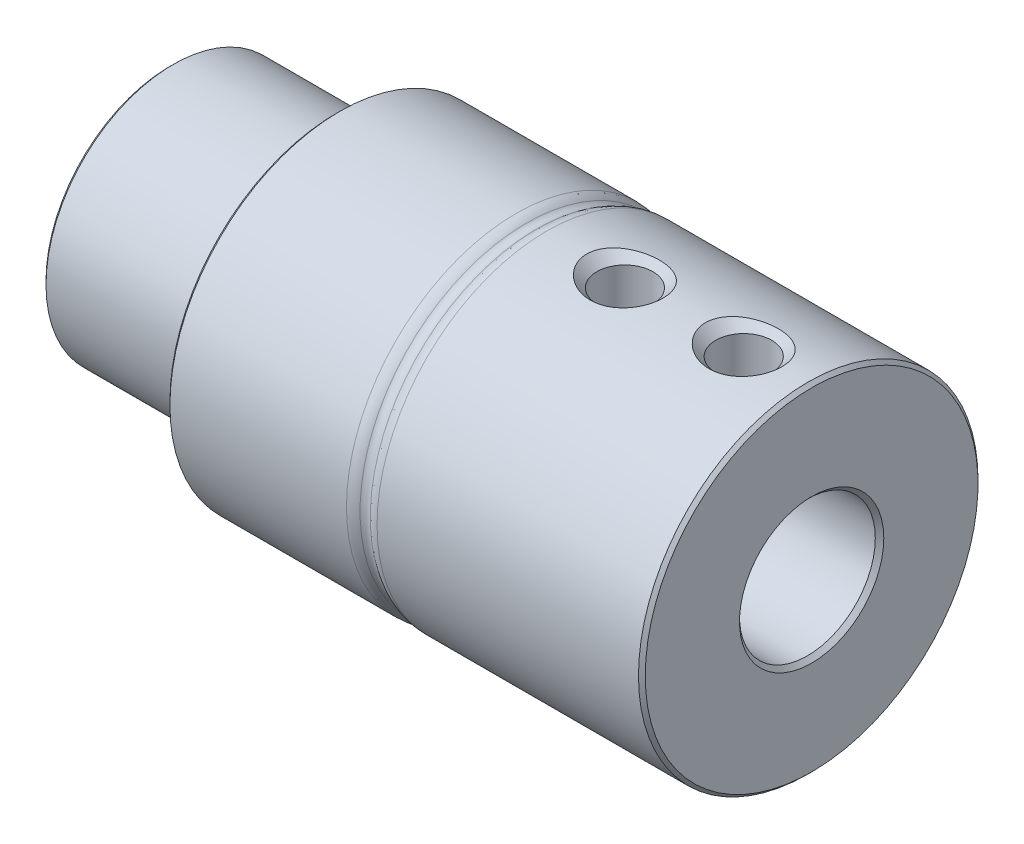
ISO-10303-21;
HEADER;
FILE_DESCRIPTION(('STEP AP214'),'2;1');
FILE_NAME('part.step','',(''),(''),'','','');
FILE_SCHEMA(('AUTOMOTIVE_DESIGN { 1 0 10303 214 1 1 1 1 }'));
ENDSEC;
DATA;
#1=APPLICATION_CONTEXT('core data for automotive mechanical design processes');
#2=APPLICATION_PROTOCOL_DEFINITION('international standard','automotive_design',2000,#1);
#3=PRODUCT_CONTEXT('',#1,'mechanical');
#4=PRODUCT('Part','Part','',(#3));
#5=PRODUCT_RELATED_PRODUCT_CATEGORY('part','',(#4));
#6=PRODUCT_DEFINITION_FORMATION('','',#4);
#7=PRODUCT_DEFINITION_CONTEXT('part definition',#1,'design');
#8=PRODUCT_DEFINITION('design','',#6,#7);
#9=PRODUCT_DEFINITION_SHAPE('','',#8);
#10=(LENGTH_UNIT() NAMED_UNIT(*) SI_UNIT(.MILLI.,.METRE.));
#11=(NAMED_UNIT(*) PLANE_ANGLE_UNIT() SI_UNIT($,.RADIAN.));
#12=(NAMED_UNIT(*) SI_UNIT($,.STERADIAN.) SOLID_ANGLE_UNIT());
#13=UNCERTAINTY_MEASURE_WITH_UNIT(LENGTH_MEASURE(1.E-05),#10,'distance_accuracy_value','');
#14=(GEOMETRIC_REPRESENTATION_CONTEXT(3) GLOBAL_UNCERTAINTY_ASSIGNED_CONTEXT((#13)) GLOBAL_UNIT_ASSIGNED_CONTEXT((#10,
#11,#12)) REPRESENTATION_CONTEXT('',''));
#15=CARTESIAN_POINT('',(0.,0.,0.));
#16=DIRECTION('',(0.,0.,1.));
#17=DIRECTION('',(1.,0.,0.));
#18=AXIS2_PLACEMENT_3D('',#15,#16,#17);
#19=CARTESIAN_POINT('',(16.5,0.,0.199999999999999));
#20=DIRECTION('',(1.,0.,0.));
#21=DIRECTION('',(0.,0.,-1.));
#22=AXIS2_PLACEMENT_3D('',#19,#20,#21);
#23=PLANE('',#22);
#24=CARTESIAN_POINT('',(16.5,0.,10.2));
#25=DIRECTION('',(1.,0.,0.));
#26=DIRECTION('',(0.,0.,-1.));
#27=AXIS2_PLACEMENT_3D('',#24,#25,#26);
#28=CIRCLE('',#27,9.80000000000001);
#29=CARTESIAN_POINT('',(16.5,0.,20.));
#30=VERTEX_POINT('',#29);
#31=EDGE_CURVE('E491',#30,#30,#28,.T.);
#32=ORIENTED_EDGE('',*,*,#31,.T.);
#33=EDGE_LOOP('',(#32));
#34=FACE_BOUND('',#33,.T.);
#35=CARTESIAN_POINT('',(16.5,0.,10.2));
#36=DIRECTION('',(1.,0.,0.));
#37=DIRECTION('',(0.,0.,-1.));
#38=AXIS2_PLACEMENT_3D('',#35,#36,#37);
#39=CIRCLE('',#38,4.25);
#40=CARTESIAN_POINT('',(16.5,0.,5.95));
#41=VERTEX_POINT('',#40);
#42=EDGE_CURVE('E83',#41,#41,#39,.T.);
#43=ORIENTED_EDGE('',*,*,#42,.F.);
#44=EDGE_LOOP('',(#43));
#45=FACE_BOUND('',#44,.T.);
#46=ADVANCED_FACE('F50',(#34,#45),#23,.T.);
#47=CARTESIAN_POINT('',(16.5,0.,10.2));
#48=DIRECTION('',(1.,0.,0.));
#49=DIRECTION('',(0.,0.,-1.));
#50=AXIS2_PLACEMENT_3D('',#47,#48,#49);
#51=CYLINDRICAL_SURFACE('',#50,9.99999999999999);
#52=CARTESIAN_POINT('',(16.3,0.,10.2));
#53=DIRECTION('',(1.,0.,0.));
#54=DIRECTION('',(0.,0.,-1.));
#55=AXIS2_PLACEMENT_3D('',#52,#53,#54);
#56=CIRCLE('',#55,9.99999999999999);
#57=CARTESIAN_POINT('',(16.3,0.,20.2));
#58=VERTEX_POINT('',#57);
#59=EDGE_CURVE('E494',#58,#58,#56,.F.);
#60=ORIENTED_EDGE('',*,*,#59,.T.);
#61=EDGE_LOOP('',(#60));
#62=FACE_BOUND('',#61,.T.);
#63=CARTESIAN_POINT('',(10.9846537924746,9.88603260036709,8.69455629700075));
#64=CARTESIAN_POINT('',(10.9035315273726,9.89625693117449,8.76170239927728));
#65=CARTESIAN_POINT('',(10.8272571478083,9.90666921452912,8.83466471045659));
#66=CARTESIAN_POINT('',(10.6863902527629,9.92699029845477,8.99124315316538));
#67=CARTESIAN_POINT('',(10.6218001491977,9.93689899477046,9.07486147829478));
#68=CARTESIAN_POINT('',(10.4987826441164,9.95651113243081,9.26301244320353));
#69=CARTESIAN_POINT('',(10.4422928347078,9.96601498927841,9.36884887170397));
#70=CARTESIAN_POINT('',(10.3498872303476,9.98195100205263,9.58939772800091));
#71=CARTESIAN_POINT('',(10.3139636342935,9.98838432252992,9.70410677150249));
#72=CARTESIAN_POINT('',(10.2671892934914,9.99683539867368,9.92705030016634));
#73=CARTESIAN_POINT('',(10.2542439218267,9.99922103194893,10.034833027109));
#74=CARTESIAN_POINT('',(10.247530829243,10.0004530534307,10.2509895053473));
#75=CARTESIAN_POINT('',(10.2537546796069,9.99930099716183,10.3593629759739));
#76=CARTESIAN_POINT('',(10.2841240315445,9.99376896093433,10.5671235052229));
#77=CARTESIAN_POINT('',(10.3072279503326,9.98957668453231,10.6666707151212));
#78=CARTESIAN_POINT('',(10.3691021237395,9.97862943649629,10.8606022385836));
#79=CARTESIAN_POINT('',(10.40787400308,9.97187419909517,10.9549860155618));
#80=CARTESIAN_POINT('',(10.5009917433412,9.95622865143849,11.1393356703464));
#81=CARTESIAN_POINT('',(10.5557960286728,9.94727696750558,11.2290637185389));
#82=CARTESIAN_POINT('',(10.678438598217,9.92823310116071,11.3989622063265));
#83=CARTESIAN_POINT('',(10.7462813136445,9.91814053149121,11.4791293815287));
#84=CARTESIAN_POINT('',(10.899718653316,9.89677295622071,11.6355074625141));
#85=CARTESIAN_POINT('',(10.986372385822,9.88547460967943,11.7106753116424));
#86=CARTESIAN_POINT('',(11.1702111631925,9.86369238459381,11.8469191907107));
#87=CARTESIAN_POINT('',(11.2674005588183,9.85320884562073,11.9079893661082));
#88=CARTESIAN_POINT('',(11.4796124873756,9.83309841025934,12.0203724068985));
#89=CARTESIAN_POINT('',(11.5954510672293,9.82365116412497,12.0701797877399));
#90=CARTESIAN_POINT('',(11.8336878177362,9.8079018623804,12.151093007232));
#91=CARTESIAN_POINT('',(11.9560878542342,9.8016007067167,12.1821934952525));
#92=CARTESIAN_POINT('',(12.2115321469784,9.79254992392328,12.2264551985508));
#93=CARTESIAN_POINT('',(12.3447830645484,9.79002620443447,12.2384777447064));
#94=CARTESIAN_POINT('',(12.6114941585069,9.78953236083092,12.2408465140647));
#95=CARTESIAN_POINT('',(12.7449543624852,9.79156289834626,12.2311895877325));
#96=CARTESIAN_POINT('',(13.010594942667,9.80001322289261,12.1900223163856));
#97=CARTESIAN_POINT('',(13.1427178536597,9.80650489000115,12.1581539678708));
#98=CARTESIAN_POINT('',(13.3995494194704,9.82317499512829,12.0727294305994));
#99=CARTESIAN_POINT('',(13.524257269633,9.83335383241824,12.0191708930104));
#100=CARTESIAN_POINT('',(13.7607785000462,9.85600097776925,11.8921405739948));
#101=CARTESIAN_POINT('',(13.8727390090067,9.86843764985179,11.8189379892576));
#102=CARTESIAN_POINT('',(14.0816936647795,9.89413227566757,11.6536553701241));
#103=CARTESIAN_POINT('',(14.1786915046926,9.9073900256057,11.5615800070335));
#104=CARTESIAN_POINT('',(14.3483925534878,9.93217777119032,11.3665789752061));
#105=CARTESIAN_POINT('',(14.422195803778,9.94376360751462,11.2646212978993));
#106=CARTESIAN_POINT('',(14.549358290333,9.96453072159553,11.048443528125));
#107=CARTESIAN_POINT('',(14.6027365281296,9.97371423172386,10.9342349600386));
#108=CARTESIAN_POINT('',(14.6815954368752,9.98756095645832,10.7098098735349));
#109=CARTESIAN_POINT('',(14.7094226519859,9.99259845373778,10.6004403027399));
#110=CARTESIAN_POINT('',(14.7447489444294,9.99902408234825,10.3783760933902));
#111=CARTESIAN_POINT('',(14.7522604864107,10.0004144513531,10.2656835365787));
#112=CARTESIAN_POINT('',(14.7467904173088,9.99941118863653,10.0503044506655));
#113=CARTESIAN_POINT('',(14.7354714606304,9.99732453747136,9.94756990663607));
#114=CARTESIAN_POINT('',(14.6960010232261,9.99017823834872,9.74551228480269));
#115=CARTESIAN_POINT('',(14.6678500721675,9.9851186839423,9.64618909975447));
#116=CARTESIAN_POINT('',(14.5959497002841,9.97256308862196,9.45345006347205));
#117=CARTESIAN_POINT('',(14.5521845174088,9.96506458634895,9.36004029423644));
#118=CARTESIAN_POINT('',(14.4507839325336,9.94837975349546,9.18126808705224));
#119=CARTESIAN_POINT('',(14.3931448238785,9.93919297201786,9.09590780815841));
#120=CARTESIAN_POINT('',(14.2609990426039,9.91922860639836,8.92856433783002));
#121=CARTESIAN_POINT('',(14.1855360369035,9.90838301496087,8.84734578161819));
#122=CARTESIAN_POINT('',(14.0231181278742,9.88675005924622,8.697359735229));
#123=CARTESIAN_POINT('',(13.936158442375,9.87596272115438,8.62859745474288));
#124=CARTESIAN_POINT('',(13.7437705772429,9.85437409023575,8.49820042923009));
#125=CARTESIAN_POINT('',(13.637364053213,9.84368167773262,8.43798941741428));
#126=CARTESIAN_POINT('',(13.4163368481885,9.8246379897128,8.33472489425612));
#127=CARTESIAN_POINT('',(13.3017134270348,9.81628749978024,8.29167713818991));
#128=CARTESIAN_POINT('',(13.0584313312803,9.80226177233624,8.22083865697275));
#129=CARTESIAN_POINT('',(12.9293610292301,9.79682929234243,8.19440749194509));
#130=CARTESIAN_POINT('',(12.6685376443446,9.79024135106289,8.16249176437543));
#131=CARTESIAN_POINT('',(12.5367839495053,9.78908687670262,8.15701203526929));
#132=CARTESIAN_POINT('',(12.2702761706399,9.79121767575256,8.16724583138672));
#133=CARTESIAN_POINT('',(12.1355465756753,9.7946333452567,8.18358177934339));
#134=CARTESIAN_POINT('',(11.870801942217,9.80573254112515,8.238270770549));
#135=CARTESIAN_POINT('',(11.7407865476573,9.81341574444213,8.27662214726302));
#136=CARTESIAN_POINT('',(11.5009587548234,9.83125393095512,8.37011546444291));
#137=CARTESIAN_POINT('',(11.3903894271927,9.84111514123757,8.4233798527864));
#138=CARTESIAN_POINT('',(11.179264545899,9.86257846797385,8.54668455359318));
#139=CARTESIAN_POINT('',(11.0787012778111,9.87417922570508,8.61671179819004));
#140=CARTESIAN_POINT('',(10.9846537924746,9.88603260036709,8.69455629700075));
#141=B_SPLINE_CURVE_WITH_KNOTS('',3,(#63,#64,#65,#66,#67,#68,#69,#70,#71,#72,#73,#74,#75,#76,
#77,#78,#79,#80,#81,#82,#83,#84,#85,#86,#87,#88,#89,#90,#91,#92,#93,#94,#95,#96,#97,#98,#99,
#100,#101,#102,#103,#104,#105,#106,#107,#108,#109,#110,#111,#112,#113,#114,#115,#116,#117,#118,
#119,#120,#121,#122,#123,#124,#125,#126,#127,#128,#129,#130,#131,#132,#133,#134,#135,#136,#137,
#138,#139,#140),.UNSPECIFIED.,.T.,.F.,(4,2,2,2,2,2,2,2,2,2,2,2,2,2,2,2,2,2,2,2,2,2,2,2,2,2,2,2,
2,2,2,2,2,2,2,2,2,2,4),(0.,0.317089332502137,0.634244045374656,0.993245382531227,
1.35211045420609,1.67615440433752,2.00005589251517,2.30549799691803,2.61097178290395,
2.9262151168174,3.24156577876967,3.58593788599461,3.93045274929634,4.3081365443467,
4.68592831491858,5.08551920660571,5.48516815352986,5.89141225808059,6.29770036660692,
6.69868245560688,7.09956541490433,7.47666153955614,7.85340599115284,8.19046131064679,
8.52730978343269,8.83596402104849,9.14460854647951,9.45356552403143,9.76260513649395,
10.095412699761,10.4283591361286,10.7949712960034,11.1617062870745,11.5554916271135,
11.9493678068157,12.3547251681056,12.7600518484971,13.1279489362486,13.4955601501534),.UNSPECIFIED.);
#142=CARTESIAN_POINT('',(10.9846537924746,9.88603260036709,8.69455629700075));
#143=VERTEX_POINT('',#142);
#144=EDGE_CURVE('E115',#143,#143,#141,.T.);
#145=ORIENTED_EDGE('',*,*,#144,.F.);
#146=EDGE_LOOP('',(#145));
#147=FACE_BOUND('',#146,.T.);
#148=CARTESIAN_POINT('',(3.98465379247462,9.88603260036709,8.69455629700075));
#149=CARTESIAN_POINT('',(3.90353152737264,9.89625693117449,8.76170239927728));
#150=CARTESIAN_POINT('',(3.82725714780832,9.90666921452912,8.83466471045659));
#151=CARTESIAN_POINT('',(3.68639025276287,9.92699029845477,8.99124315316538));
#152=CARTESIAN_POINT('',(3.62180014919773,9.93689899477046,9.07486147829479));
#153=CARTESIAN_POINT('',(3.49878264411639,9.95651113243081,9.26301244320353));
#154=CARTESIAN_POINT('',(3.44229283470783,9.96601498927841,9.36884887170398));
#155=CARTESIAN_POINT('',(3.34988723034761,9.98195100205263,9.58939772800091));
#156=CARTESIAN_POINT('',(3.31396363429347,9.98838432252992,9.70410677150249));
#157=CARTESIAN_POINT('',(3.26718929349145,9.99683539867368,9.92705030016635));
#158=CARTESIAN_POINT('',(3.25424392182672,9.99922103194893,10.034833027109));
#159=CARTESIAN_POINT('',(3.24753082924303,10.0004530534307,10.2509895053473));
#160=CARTESIAN_POINT('',(3.25375467960691,9.99930099716183,10.3593629759739));
#161=CARTESIAN_POINT('',(3.28412403154448,9.99376896093433,10.5671235052229));
#162=CARTESIAN_POINT('',(3.30722795033262,9.98957668453231,10.6666707151212));
#163=CARTESIAN_POINT('',(3.36910212373954,9.97862943649629,10.8606022385836));
#164=CARTESIAN_POINT('',(3.40787400307997,9.97187419909517,10.9549860155618));
#165=CARTESIAN_POINT('',(3.50099174334124,9.95622865143849,11.1393356703465));
#166=CARTESIAN_POINT('',(3.5557960286728,9.94727696750558,11.2290637185389));
#167=CARTESIAN_POINT('',(3.678438598217,9.92823310116071,11.3989622063265));
#168=CARTESIAN_POINT('',(3.74628131364445,9.91814053149121,11.4791293815287));
#169=CARTESIAN_POINT('',(3.89971865331604,9.89677295622071,11.6355074625141));
#170=CARTESIAN_POINT('',(3.98637238582202,9.88547460967943,11.7106753116424));
#171=CARTESIAN_POINT('',(4.17021116319252,9.86369238459381,11.8469191907107));
#172=CARTESIAN_POINT('',(4.26740055881831,9.85320884562073,11.9079893661082));
#173=CARTESIAN_POINT('',(4.47961248737557,9.83309841025934,12.0203724068985));
#174=CARTESIAN_POINT('',(4.59545106722935,9.82365116412497,12.0701797877399));
#175=CARTESIAN_POINT('',(4.83368781773615,9.8079018623804,12.151093007232));
#176=CARTESIAN_POINT('',(4.95608785423416,9.8016007067167,12.1821934952525));
#177=CARTESIAN_POINT('',(5.21153214697842,9.79254992392328,12.2264551985508));
#178=CARTESIAN_POINT('',(5.34478306454842,9.79002620443447,12.2384777447064));
#179=CARTESIAN_POINT('',(5.61149415850688,9.78953236083092,12.2408465140647));
#180=CARTESIAN_POINT('',(5.74495436248516,9.79156289834626,12.2311895877325));
#181=CARTESIAN_POINT('',(6.01059494266705,9.80001322289261,12.1900223163856));
#182=CARTESIAN_POINT('',(6.14271785365966,9.80650489000115,12.1581539678708));
#183=CARTESIAN_POINT('',(6.39954941947035,9.82317499512829,12.0727294305994));
#184=CARTESIAN_POINT('',(6.52425726963304,9.83335383241824,12.0191708930104));
#185=CARTESIAN_POINT('',(6.7607785000462,9.85600097776925,11.8921405739948));
#186=CARTESIAN_POINT('',(6.87273900900666,9.86843764985179,11.8189379892576));
#187=CARTESIAN_POINT('',(7.08169366477946,9.89413227566757,11.6536553701241));
#188=CARTESIAN_POINT('',(7.17869150469258,9.9073900256057,11.5615800070335));
#189=CARTESIAN_POINT('',(7.34839255348777,9.93217777119032,11.3665789752061));
#190=CARTESIAN_POINT('',(7.42219580377804,9.94376360751462,11.2646212978993));
#191=CARTESIAN_POINT('',(7.54935829033297,9.96453072159553,11.048443528125));
#192=CARTESIAN_POINT('',(7.60273652812958,9.97371423172386,10.9342349600386));
#193=CARTESIAN_POINT('',(7.6815954368752,9.98756095645832,10.7098098735349));
#194=CARTESIAN_POINT('',(7.70942265198586,9.99259845373778,10.6004403027399));
#195=CARTESIAN_POINT('',(7.74474894442945,9.99902408234825,10.3783760933902));
#196=CARTESIAN_POINT('',(7.75226048641067,10.0004144513531,10.2656835365787));
#197=CARTESIAN_POINT('',(7.74679041730878,9.99941118863653,10.0503044506655));
#198=CARTESIAN_POINT('',(7.73547146063038,9.99732453747136,9.94756990663607));
#199=CARTESIAN_POINT('',(7.69600102322612,9.99017823834872,9.74551228480269));
#200=CARTESIAN_POINT('',(7.66785007216753,9.9851186839423,9.64618909975448));
#201=CARTESIAN_POINT('',(7.59594970028414,9.97256308862196,9.45345006347206));
#202=CARTESIAN_POINT('',(7.55218451740875,9.96506458634894,9.36004029423644));
#203=CARTESIAN_POINT('',(7.4507839325336,9.94837975349546,9.18126808705225));
#204=CARTESIAN_POINT('',(7.39314482387851,9.93919297201786,9.09590780815842));
#205=CARTESIAN_POINT('',(7.26099904260387,9.91922860639836,8.92856433783002));
#206=CARTESIAN_POINT('',(7.18553603690345,9.90838301496087,8.84734578161819));
#207=CARTESIAN_POINT('',(7.02311812787422,9.88675005924622,8.69735973522901));
#208=CARTESIAN_POINT('',(6.93615844237501,9.87596272115438,8.62859745474289));
#209=CARTESIAN_POINT('',(6.74377057724292,9.85437409023575,8.49820042923009));
#210=CARTESIAN_POINT('',(6.63736405321302,9.84368167773262,8.43798941741429));
#211=CARTESIAN_POINT('',(6.41633684818854,9.8246379897128,8.33472489425612));
#212=CARTESIAN_POINT('',(6.30171342703475,9.81628749978024,8.29167713818992));
#213=CARTESIAN_POINT('',(6.05843133128027,9.80226177233624,8.22083865697276));
#214=CARTESIAN_POINT('',(5.9293610292301,9.79682929234243,8.1944074919451));
#215=CARTESIAN_POINT('',(5.6685376443446,9.79024135106289,8.16249176437544));
#216=CARTESIAN_POINT('',(5.53678394950526,9.78908687670263,8.1570120352693));
#217=CARTESIAN_POINT('',(5.27027617063989,9.79121767575256,8.16724583138672));
#218=CARTESIAN_POINT('',(5.13554657567532,9.7946333452567,8.18358177934339));
#219=CARTESIAN_POINT('',(4.87080194221703,9.80573254112515,8.238270770549));
#220=CARTESIAN_POINT('',(4.74078654765734,9.81341574444213,8.27662214726302));
#221=CARTESIAN_POINT('',(4.5009587548234,9.83125393095512,8.37011546444292));
#222=CARTESIAN_POINT('',(4.39038942719271,9.84111514123757,8.42337985278641));
#223=CARTESIAN_POINT('',(4.179264545899,9.86257846797385,8.54668455359318));
#224=CARTESIAN_POINT('',(4.07870127781109,9.87417922570508,8.61671179819005));
#225=CARTESIAN_POINT('',(3.98465379247462,9.88603260036709,8.69455629700075));
#226=B_SPLINE_CURVE_WITH_KNOTS('',3,(#148,#149,#150,#151,#152,#153,#154,#155,#156,#157,#158,
#159,#160,#161,#162,#163,#164,#165,#166,#167,#168,#169,#170,#171,#172,#173,#174,#175,#176,#177,
#178,#179,#180,#181,#182,#183,#184,#185,#186,#187,#188,#189,#190,#191,#192,#193,#194,#195,#196,
#197,#198,#199,#200,#201,#202,#203,#204,#205,#206,#207,#208,#209,#210,#211,#212,#213,#214,#215,
#216,#217,#218,#219,#220,#221,#222,#223,#224,#225),.UNSPECIFIED.,.T.,.F.,(4,2,2,2,2,2,2,2,2,2,2,
2,2,2,2,2,2,2,2,2,2,2,2,2,2,2,2,2,2,2,2,2,2,2,2,2,2,2,4),(0.,0.317089332502138,
0.634244045374655,0.993245382531227,1.35211045420609,1.67615440433751,2.00005589251516,
2.30549799691803,2.61097178290395,2.92621511681741,3.24156577876967,3.58593788599461,
3.93045274929634,4.3081365443467,4.68592831491858,5.08551920660571,5.48516815352986,
5.89141225808059,6.29770036660692,6.69868245560688,7.09956541490433,7.47666153955614,
7.85340599115284,8.19046131064679,8.52730978343269,8.83596402104849,9.14460854647951,
9.45356552403143,9.76260513649395,10.095412699761,10.4283591361286,10.7949712960034,
11.1617062870745,11.5554916271135,11.9493678068157,12.3547251681055,12.7600518484971,
13.1279489362486,13.4955601501534),.UNSPECIFIED.);
#227=CARTESIAN_POINT('',(3.98465379247462,9.88603260036709,8.69455629700075));
#228=VERTEX_POINT('',#227);
#229=EDGE_CURVE('E106',#228,#228,#226,.T.);
#230=ORIENTED_EDGE('',*,*,#229,.F.);
#231=EDGE_LOOP('',(#230));
#232=FACE_BOUND('',#231,.T.);
#233=CARTESIAN_POINT('',(0.900000000000001,0.,10.2));
#234=DIRECTION('',(1.,0.,0.));
#235=DIRECTION('',(0.,0.,-1.));
#236=AXIS2_PLACEMENT_3D('',#233,#234,#235);
#237=CIRCLE('',#236,10.);
#238=CARTESIAN_POINT('',(0.900000000000001,0.,0.199999999999999));
#239=VERTEX_POINT('',#238);
#240=EDGE_CURVE('E102',#239,#239,#237,.T.);
#241=ORIENTED_EDGE('',*,*,#240,.T.);
#242=EDGE_LOOP('',(#241));
#243=FACE_BOUND('',#242,.T.);
#244=ADVANCED_FACE('F121',(#62,#147,#232,#243),#51,.T.);
#245=CARTESIAN_POINT('',(0.9,0.,10.2));
#246=DIRECTION('',(1.,0.,0.));
#247=DIRECTION('',(0.,0.,-1.));
#248=AXIS2_PLACEMENT_3D('',#245,#246,#247);
#249=TOROIDAL_SURFACE('',#248,9.,1.);
#250=CARTESIAN_POINT('',(0.299999999999998,0.,10.2));
#251=DIRECTION('',(1.,0.,0.));
#252=DIRECTION('',(0.,0.,-1.));
#253=AXIS2_PLACEMENT_3D('',#250,#251,#252);
#254=CIRCLE('',#253,9.8);
#255=CARTESIAN_POINT('',(0.299999999999997,0.,0.399999999999999));
#256=VERTEX_POINT('',#255);
#257=EDGE_CURVE('E98',#256,#256,#254,.T.);
#258=ORIENTED_EDGE('',*,*,#257,.T.);
#259=EDGE_LOOP('',(#258));
#260=FACE_BOUND('',#259,.T.);
#261=ORIENTED_EDGE('',*,*,#240,.F.);
#262=EDGE_LOOP('',(#261));
#263=FACE_BOUND('',#262,.T.);
#264=ADVANCED_FACE('F163',(#260,#263),#249,.T.);
#265=CARTESIAN_POINT('',(0.,0.,10.2));
#266=DIRECTION('',(1.,0.,0.));
#267=DIRECTION('',(0.,0.,-1.));
#268=AXIS2_PLACEMENT_3D('',#265,#266,#267);
#269=TOROIDAL_SURFACE('',#268,10.2,0.499999999999999);
#270=CARTESIAN_POINT('',(-0.299999999999998,0.,10.2));
#271=DIRECTION('',(1.,0.,0.));
#272=DIRECTION('',(0.,0.,-1.));
#273=AXIS2_PLACEMENT_3D('',#270,#271,#272);
#274=CIRCLE('',#273,9.8);
#275=CARTESIAN_POINT('',(-0.299999999999999,0.,0.399999999999999));
#276=VERTEX_POINT('',#275);
#277=EDGE_CURVE('E94',#276,#276,#274,.T.);
#278=ORIENTED_EDGE('',*,*,#277,.T.);
#279=EDGE_LOOP('',(#278));
#280=FACE_BOUND('',#279,.T.);
#281=ORIENTED_EDGE('',*,*,#257,.F.);
#282=EDGE_LOOP('',(#281));
#283=FACE_BOUND('',#282,.T.);
#284=ADVANCED_FACE('F244',(#280,#283),#269,.F.);
#285=CARTESIAN_POINT('',(-0.9,0.,10.2));
#286=DIRECTION('',(1.,0.,0.));
#287=DIRECTION('',(0.,0.,-1.));
#288=AXIS2_PLACEMENT_3D('',#285,#286,#287);
#289=TOROIDAL_SURFACE('',#288,9.,1.);
#290=CARTESIAN_POINT('',(-0.900000000000001,0.,10.2));
#291=DIRECTION('',(1.,0.,0.));
#292=DIRECTION('',(0.,0.,-1.));
#293=AXIS2_PLACEMENT_3D('',#290,#291,#292);
#294=CIRCLE('',#293,10.);
#295=CARTESIAN_POINT('',(-0.900000000000002,0.,0.199999999999999));
#296=VERTEX_POINT('',#295);
#297=EDGE_CURVE('E90',#296,#296,#294,.T.);
#298=ORIENTED_EDGE('',*,*,#297,.T.);
#299=EDGE_LOOP('',(#298));
#300=FACE_BOUND('',#299,.T.);
#301=ORIENTED_EDGE('',*,*,#277,.F.);
#302=EDGE_LOOP('',(#301));
#303=FACE_BOUND('',#302,.T.);
#304=ADVANCED_FACE('F240',(#300,#303),#289,.T.);
#305=CARTESIAN_POINT('',(16.5,0.,10.2));
#306=DIRECTION('',(1.,0.,0.));
#307=DIRECTION('',(0.,0.,-1.));
#308=AXIS2_PLACEMENT_3D('',#305,#306,#307);
#309=CYLINDRICAL_SURFACE('',#308,10.);
#310=CARTESIAN_POINT('',(-11.3000000000002,0.,10.2));
#311=DIRECTION('',(-1.,0.,0.));
#312=DIRECTION('',(0.,0.,1.));
#313=AXIS2_PLACEMENT_3D('',#310,#311,#312);
#314=CIRCLE('',#313,10.);
#315=CARTESIAN_POINT('',(-11.3000000000002,0.,20.2));
#316=VERTEX_POINT('',#315);
#317=EDGE_CURVE('E207',#316,#316,#314,.F.);
#318=ORIENTED_EDGE('',*,*,#317,.T.);
#319=EDGE_LOOP('',(#318));
#320=FACE_BOUND('',#319,.T.);
#321=ORIENTED_EDGE('',*,*,#297,.F.);
#322=EDGE_LOOP('',(#321));
#323=FACE_BOUND('',#322,.T.);
#324=ADVANCED_FACE('F236',(#320,#323),#309,.T.);
#325=CARTESIAN_POINT('',(-11.5000000000002,0.,1.7));
#326=DIRECTION('',(-1.,0.,0.));
#327=DIRECTION('',(0.,0.,1.));
#328=AXIS2_PLACEMENT_3D('',#325,#326,#327);
#329=PLANE('',#328);
#330=CARTESIAN_POINT('',(-11.5000000000002,0.,10.2));
#331=DIRECTION('',(-1.,0.,0.));
#332=DIRECTION('',(0.,0.,1.));
#333=AXIS2_PLACEMENT_3D('',#330,#331,#332);
#334=CIRCLE('',#333,9.79999999999999);
#335=CARTESIAN_POINT('',(-11.5000000000002,0.,20.));
#336=VERTEX_POINT('',#335);
#337=EDGE_CURVE('E200',#336,#336,#334,.T.);
#338=ORIENTED_EDGE('',*,*,#337,.T.);
#339=EDGE_LOOP('',(#338));
#340=FACE_BOUND('',#339,.T.);
#341=CARTESIAN_POINT('',(-11.5000000000002,0.,10.2));
#342=DIRECTION('',(1.,0.,0.));
#343=DIRECTION('',(0.,0.,-1.));
#344=AXIS2_PLACEMENT_3D('',#341,#342,#343);
#345=CIRCLE('',#344,8.49999999999999);
#346=CARTESIAN_POINT('',(-11.5000000000002,0.,1.7));
#347=VERTEX_POINT('',#346);
#348=EDGE_CURVE('E80',#347,#347,#345,.T.);
#349=ORIENTED_EDGE('',*,*,#348,.T.);
#350=EDGE_LOOP('',(#349));
#351=FACE_BOUND('',#350,.T.);
#352=ADVANCED_FACE('F230',(#340,#351),#329,.T.);
#353=CARTESIAN_POINT('',(16.5,0.,10.2));
#354=DIRECTION('',(1.,0.,0.));
#355=DIRECTION('',(0.,0.,-1.));
#356=AXIS2_PLACEMENT_3D('',#353,#354,#355);
#357=CYLINDRICAL_SURFACE('',#356,8.5);
#358=CARTESIAN_POINT('',(-12.3000000000002,0.,10.2));
#359=DIRECTION('',(-1.,0.,0.));
#360=DIRECTION('',(0.,0.,1.));
#361=AXIS2_PLACEMENT_3D('',#358,#359,#360);
#362=CIRCLE('',#361,8.5);
#363=CARTESIAN_POINT('',(-12.3000000000002,0.,18.7));
#364=VERTEX_POINT('',#363);
#365=EDGE_CURVE('E197',#364,#364,#362,.F.);
#366=ORIENTED_EDGE('',*,*,#365,.T.);
#367=EDGE_LOOP('',(#366));
#368=FACE_BOUND('',#367,.T.);
#369=ORIENTED_EDGE('',*,*,#348,.F.);
#370=EDGE_LOOP('',(#369));
#371=FACE_BOUND('',#370,.T.);
#372=ADVANCED_FACE('F224',(#368,#371),#357,.T.);
#373=CARTESIAN_POINT('',(-12.5000000000002,0.,2.7));
#374=DIRECTION('',(-1.,0.,0.));
#375=DIRECTION('',(0.,0.,1.));
#376=AXIS2_PLACEMENT_3D('',#373,#374,#375);
#377=PLANE('',#376);
#378=CARTESIAN_POINT('',(-12.5000000000002,0.,10.2));
#379=DIRECTION('',(-1.,0.,0.));
#380=DIRECTION('',(0.,0.,1.));
#381=AXIS2_PLACEMENT_3D('',#378,#379,#380);
#382=CIRCLE('',#381,8.29999999999998);
#383=CARTESIAN_POINT('',(-12.5000000000002,0.,18.5));
#384=VERTEX_POINT('',#383);
#385=EDGE_CURVE('E194',#384,#384,#382,.T.);
#386=ORIENTED_EDGE('',*,*,#385,.T.);
#387=EDGE_LOOP('',(#386));
#388=FACE_BOUND('',#387,.T.);
#389=CARTESIAN_POINT('',(-12.5000000000003,0.,10.2));
#390=DIRECTION('',(1.,0.,0.));
#391=DIRECTION('',(0.,0.,-1.));
#392=AXIS2_PLACEMENT_3D('',#389,#390,#391);
#393=CIRCLE('',#392,7.5);
#394=CARTESIAN_POINT('',(-12.5000000000003,0.,2.7));
#395=VERTEX_POINT('',#394);
#396=EDGE_CURVE('E73',#395,#395,#393,.T.);
#397=ORIENTED_EDGE('',*,*,#396,.T.);
#398=EDGE_LOOP('',(#397));
#399=FACE_BOUND('',#398,.T.);
#400=ADVANCED_FACE('F219',(#388,#399),#377,.T.);
#401=CARTESIAN_POINT('',(16.5,0.,10.2));
#402=DIRECTION('',(1.,0.,0.));
#403=DIRECTION('',(0.,0.,-1.));
#404=AXIS2_PLACEMENT_3D('',#401,#402,#403);
#405=CYLINDRICAL_SURFACE('',#404,7.5);
#406=CARTESIAN_POINT('',(-21.1000000000001,0.,10.2));
#407=DIRECTION('',(-1.,0.,0.));
#408=DIRECTION('',(0.,0.,1.));
#409=AXIS2_PLACEMENT_3D('',#406,#407,#408);
#410=CIRCLE('',#409,7.5);
#411=CARTESIAN_POINT('',(-21.1000000000001,0.,17.7));
#412=VERTEX_POINT('',#411);
#413=EDGE_CURVE('E59',#412,#412,#410,.F.);
#414=ORIENTED_EDGE('',*,*,#413,.T.);
#415=EDGE_LOOP('',(#414));
#416=FACE_BOUND('',#415,.T.);
#417=ORIENTED_EDGE('',*,*,#396,.F.);
#418=EDGE_LOOP('',(#417));
#419=FACE_BOUND('',#418,.T.);
#420=ADVANCED_FACE('F215',(#416,#419),#405,.T.);
#421=CARTESIAN_POINT('',(-21.3000000000001,0.,10.2));
#422=DIRECTION('',(-1.,0.,0.));
#423=DIRECTION('',(0.,0.,1.));
#424=AXIS2_PLACEMENT_3D('',#421,#422,#423);
#425=PLANE('',#424);
#426=CARTESIAN_POINT('',(-21.3000000000001,0.,10.2));
#427=DIRECTION('',(-1.,0.,0.));
#428=DIRECTION('',(0.,0.,1.));
#429=AXIS2_PLACEMENT_3D('',#426,#427,#428);
#430=CIRCLE('',#429,7.29999999999999);
#431=CARTESIAN_POINT('',(-21.3000000000001,0.,17.5));
#432=VERTEX_POINT('',#431);
#433=EDGE_CURVE('E11',#432,#432,#430,.T.);
#434=ORIENTED_EDGE('',*,*,#433,.T.);
#435=EDGE_LOOP('',(#434));
#436=FACE_BOUND('',#435,.T.);
#437=ADVANCED_FACE('F66',(#436),#425,.T.);
#438=CARTESIAN_POINT('',(0.500000000000042,0.,10.2));
#439=DIRECTION('',(1.,0.,0.));
#440=DIRECTION('',(0.,0.,-1.));
#441=AXIS2_PLACEMENT_3D('',#438,#439,#440);
#442=CONICAL_SURFACE('',#441,4.,1.02974425867665);
#443=CARTESIAN_POINT('',(-1.9034424761102,0.,10.2));
#444=VERTEX_POINT('',#443);
#445=VERTEX_LOOP('',#444);
#446=FACE_BOUND('',#445,.T.);
#447=CARTESIAN_POINT('',(0.500000000000042,0.,10.2));
#448=DIRECTION('',(1.,0.,0.));
#449=DIRECTION('',(0.,0.,-1.));
#450=AXIS2_PLACEMENT_3D('',#447,#448,#449);
#451=CIRCLE('',#450,4.);
#452=CARTESIAN_POINT('',(0.500000000000042,0.,6.20000000000001));
#453=VERTEX_POINT('',#452);
#454=EDGE_CURVE('E70',#453,#453,#451,.T.);
#455=ORIENTED_EDGE('',*,*,#454,.T.);
#456=EDGE_LOOP('',(#455));
#457=FACE_BOUND('',#456,.T.);
#458=ADVANCED_FACE('F62',(#446,#457),#442,.F.);
#459=CARTESIAN_POINT('',(16.5,0.,10.2));
#460=DIRECTION('',(1.,0.,0.));
#461=DIRECTION('',(0.,0.,-1.));
#462=AXIS2_PLACEMENT_3D('',#459,#460,#461);
#463=CYLINDRICAL_SURFACE('',#462,4.);
#464=CARTESIAN_POINT('',(12.5,3.64383040220041,11.85));
#465=CARTESIAN_POINT('',(12.5880964802257,3.64383945275153,11.849990568131));
#466=CARTESIAN_POINT('',(12.6763404319736,3.64707173267573,11.8428998917736));
#467=CARTESIAN_POINT('',(12.8502870610789,3.65959209124688,11.8148084554637));
#468=CARTESIAN_POINT('',(12.9359821005976,3.66889676295874,11.7937695789634));
#469=CARTESIAN_POINT('',(13.1020029381306,3.69231325052126,11.7387353624964));
#470=CARTESIAN_POINT('',(13.1823488202186,3.70640571161012,11.7047921240017));
#471=CARTESIAN_POINT('',(13.3361817668342,3.73778230052357,11.6250653559421));
#472=CARTESIAN_POINT('',(13.409670542784,3.75506562873473,11.5792847915959));
#473=CARTESIAN_POINT('',(13.5522286878465,3.7920553041855,11.4741985629037));
#474=CARTESIAN_POINT('',(13.6208292557802,3.81184277704779,11.4142851824136));
#475=CARTESIAN_POINT('',(13.7473547719087,3.85094363418238,11.2839107216548));
#476=CARTESIAN_POINT('',(13.8052756514722,3.87025683535296,11.2134456399636));
#477=CARTESIAN_POINT('',(13.9111713713018,3.90721575035942,11.0603019435934));
#478=CARTESIAN_POINT('',(13.9586209327061,3.92475616703247,10.9772323901136));
#479=CARTESIAN_POINT('',(14.0386701453217,3.95520283117798,10.8034363618758));
#480=CARTESIAN_POINT('',(14.0712762643465,3.96811109652272,10.712713242513));
#481=CARTESIAN_POINT('',(14.1190207066562,3.98726403378776,10.5311051723044));
#482=CARTESIAN_POINT('',(14.1349668479232,3.99381564337609,10.4404656251845));
#483=CARTESIAN_POINT('',(14.1515466518552,4.0006306156112,10.2575763551499));
#484=CARTESIAN_POINT('',(14.152186395322,4.00089647540931,10.165327286229));
#485=CARTESIAN_POINT('',(14.1385635038634,3.99529224160632,9.98770261910401));
#486=CARTESIAN_POINT('',(14.1251878162829,3.98978733384658,9.9022453345996));
#487=CARTESIAN_POINT('',(14.0854311825522,3.97375926025944,9.73491415476472));
#488=CARTESIAN_POINT('',(14.0590492787093,3.96323572489496,9.6530405237945));
#489=CARTESIAN_POINT('',(13.9937123382798,3.93798907731602,9.49370439318276));
#490=CARTESIAN_POINT('',(13.9545720100751,3.92320447216362,9.41632802023753));
#491=CARTESIAN_POINT('',(13.8650087208134,3.89088763760773,9.26903951000753));
#492=CARTESIAN_POINT('',(13.8145817994967,3.87335444442336,9.19913000546068));
#493=CARTESIAN_POINT('',(13.6998117609713,3.83587133640027,9.06361469052959));
#494=CARTESIAN_POINT('',(13.6347465891013,3.81583814543089,8.99864253681354));
#495=CARTESIAN_POINT('',(13.4945903336784,3.77653142784555,8.88026161576506));
#496=CARTESIAN_POINT('',(13.4194955507367,3.75725818494772,8.82685713427797));
#497=CARTESIAN_POINT('',(13.2584015964527,3.72106607156909,8.73154660155171));
#498=CARTESIAN_POINT('',(13.1721324283073,3.70424107982557,8.69005820690723));
#499=CARTESIAN_POINT('',(12.9929533285941,3.67596385006485,8.62245491872904));
#500=CARTESIAN_POINT('',(12.9000480861262,3.66450786071417,8.59632928793878));
#501=CARTESIAN_POINT('',(12.716577104815,3.64919091711418,8.56178679644058));
#502=CARTESIAN_POINT('',(12.6262416988171,3.64489111171831,8.55234430545318));
#503=CARTESIAN_POINT('',(12.4451943703014,3.64311980380967,8.54842898327173));
#504=CARTESIAN_POINT('',(12.3544825839407,3.64564601607449,8.55395114219598));
#505=CARTESIAN_POINT('',(12.1811989909505,3.6567894436616,8.57887289498173));
#506=CARTESIAN_POINT('',(12.0984718203254,3.66501803861664,8.59738797881457));
#507=CARTESIAN_POINT('',(11.93736293562,3.68614612916707,8.64660419737985));
#508=CARTESIAN_POINT('',(11.8589822286483,3.69904670212356,8.67730814302876));
#509=CARTESIAN_POINT('',(11.7051209943043,3.72872477858182,8.75146097795015));
#510=CARTESIAN_POINT('',(11.6298998052207,3.74564214050945,8.79539020691736));
#511=CARTESIAN_POINT('',(11.4875398305702,3.78124523189863,8.89426544590548));
#512=CARTESIAN_POINT('',(11.4204045122649,3.79993171387674,8.94921615526316));
#513=CARTESIAN_POINT('',(11.2905703735533,3.83876011670653,9.07372457837901));
#514=CARTESIAN_POINT('',(11.2286482629513,3.85889967217622,9.14409612873296));
#515=CARTESIAN_POINT('',(11.1173571443379,3.89698114804694,9.29470201991989));
#516=CARTESIAN_POINT('',(11.0679889479968,3.91492292631236,9.37493699797309));
#517=CARTESIAN_POINT('',(10.9832958657932,3.94668767391886,9.54348318311672));
#518=CARTESIAN_POINT('',(10.9479965249973,3.96050313975063,9.6318087261295));
#519=CARTESIAN_POINT('',(10.8930083431412,3.98237104121021,9.81385916639481));
#520=CARTESIAN_POINT('',(10.873310417061,3.9904268305481,9.90758088718243));
#521=CARTESIAN_POINT('',(10.8512117710795,3.9994889299446,10.0908128104552));
#522=CARTESIAN_POINT('',(10.847715171258,4.00094173424749,10.1801696918814));
#523=CARTESIAN_POINT('',(10.8551854343703,3.99786220239438,10.3581617391954));
#524=CARTESIAN_POINT('',(10.8661498499954,3.99333087896147,10.4467970246485));
#525=CARTESIAN_POINT('',(10.9014446421355,3.979024148364,10.6177053759359));
#526=CARTESIAN_POINT('',(10.9253044421145,3.96943363922013,10.7000923716278));
#527=CARTESIAN_POINT('',(10.98520411488,3.94605480923816,10.8596673557342));
#528=CARTESIAN_POINT('',(11.0212463247867,3.93226568297162,10.9368543431487));
#529=CARTESIAN_POINT('',(11.1063045266864,3.90105808483759,11.0876611337326));
#530=CARTESIAN_POINT('',(11.1558312567729,3.88350423911689,11.1609642143611));
#531=CARTESIAN_POINT('',(11.26570284679,3.84685709666619,11.298529321707));
#532=CARTESIAN_POINT('',(11.3260516230808,3.82776324400832,11.3627880603165));
#533=CARTESIAN_POINT('',(11.4605875273546,3.78859741195738,11.4848776994505));
#534=CARTESIAN_POINT('',(11.5354277568849,3.76854475207571,11.5419976794716));
#535=CARTESIAN_POINT('',(11.694265975681,3.73105419200534,11.6429647467733));
#536=CARTESIAN_POINT('',(11.7782689917096,3.7136177396712,11.686804498119));
#537=CARTESIAN_POINT('',(11.9527284412699,3.68370387904713,11.7594444776665));
#538=CARTESIAN_POINT('',(12.0431391080911,3.67119480418034,11.7883411287523));
#539=CARTESIAN_POINT('',(12.2280471440783,3.65281837075147,11.8301726356757));
#540=CARTESIAN_POINT('',(12.3225296908768,3.64692873900432,11.8431610331297));
#541=CARTESIAN_POINT('',(12.4448633136426,3.64414054419779,11.8493120932942));
#542=CARTESIAN_POINT('',(12.472424432285,3.64382756923723,11.8500029523216));
#543=CARTESIAN_POINT('',(12.5,3.64383040220041,11.85));
#544=B_SPLINE_CURVE_WITH_KNOTS('',3,(#464,#465,#466,#467,#468,#469,#470,#471,#472,#473,#474,
#475,#476,#477,#478,#479,#480,#481,#482,#483,#484,#485,#486,#487,#488,#489,#490,#491,#492,#493,
#494,#495,#496,#497,#498,#499,#500,#501,#502,#503,#504,#505,#506,#507,#508,#509,#510,#511,#512,
#513,#514,#515,#516,#517,#518,#519,#520,#521,#522,#523,#524,#525,#526,#527,#528,#529,#530,#531,
#532,#533,#534,#535,#536,#537,#538,#539,#540,#541,#542,#543),.UNSPECIFIED.,.T.,.F.,(4,2,2,2,2,2,
2,2,2,2,2,2,2,2,2,2,2,2,2,2,2,2,2,2,2,2,2,2,2,2,2,2,2,2,2,2,2,2,2,4),(0.,0.264211724660743,
0.529148459018597,0.793026677872049,1.05683885985756,1.33523297260791,1.61373292676209,
1.90403076094908,2.19420198072698,2.46953816244269,2.74476495901023,3.00356896819765,
3.2623920368679,3.52515526924739,3.78801084539545,4.06907613148064,4.35024537535724,
4.64031806272423,4.9301877724111,5.20152035698263,5.47276211576042,5.72713321026165,
5.9815630002888,6.24665916965708,6.51186861189123,6.79815687284346,7.08446363898862,
7.37128791456169,7.6579450434915,7.92489841526078,8.19180661499934,8.44957452423758,
8.70739191275387,8.97680852354694,9.24632283025305,9.53374725602174,9.82133016535515,
10.1070334851925,10.3917725616093,10.4744749384331),.UNSPECIFIED.);
#545=CARTESIAN_POINT('',(12.5,3.64383040220041,11.85));
#546=VERTEX_POINT('',#545);
#547=EDGE_CURVE('E462',#546,#546,#544,.T.);
#548=ORIENTED_EDGE('',*,*,#547,.T.);
#549=EDGE_LOOP('',(#548));
#550=FACE_BOUND('',#549,.T.);
#551=CARTESIAN_POINT('',(5.49999999999998,3.64383040220041,11.85));
#552=CARTESIAN_POINT('',(5.58809648022566,3.64383945275153,11.849990568131));
#553=CARTESIAN_POINT('',(5.67634043197357,3.64707173267573,11.8428998917736));
#554=CARTESIAN_POINT('',(5.85028706107886,3.65959209124688,11.8148084554637));
#555=CARTESIAN_POINT('',(5.93598210059758,3.66889676295874,11.7937695789634));
#556=CARTESIAN_POINT('',(6.10200293813061,3.69231325052125,11.7387353624964));
#557=CARTESIAN_POINT('',(6.18234882021858,3.70640571161012,11.7047921240017));
#558=CARTESIAN_POINT('',(6.3361817668342,3.73778230052357,11.6250653559421));
#559=CARTESIAN_POINT('',(6.40967054278402,3.75506562873472,11.579284791596));
#560=CARTESIAN_POINT('',(6.55222868784648,3.7920553041855,11.4741985629037));
#561=CARTESIAN_POINT('',(6.62082925578019,3.81184277704779,11.4142851824136));
#562=CARTESIAN_POINT('',(6.74735477190874,3.85094363418238,11.2839107216548));
#563=CARTESIAN_POINT('',(6.8052756514722,3.87025683535296,11.2134456399636));
#564=CARTESIAN_POINT('',(6.91117137130184,3.90721575035942,11.0603019435934));
#565=CARTESIAN_POINT('',(6.95862093270614,3.92475616703247,10.9772323901136));
#566=CARTESIAN_POINT('',(7.03867014532168,3.95520283117798,10.8034363618759));
#567=CARTESIAN_POINT('',(7.07127626434654,3.96811109652272,10.712713242513));
#568=CARTESIAN_POINT('',(7.11902070665621,3.98726403378776,10.5311051723044));
#569=CARTESIAN_POINT('',(7.13496684792321,3.99381564337609,10.4404656251845));
#570=CARTESIAN_POINT('',(7.15154665185515,4.0006306156112,10.2575763551499));
#571=CARTESIAN_POINT('',(7.15218639532199,4.00089647540931,10.165327286229));
#572=CARTESIAN_POINT('',(7.13856350386338,3.99529224160632,9.98770261910401));
#573=CARTESIAN_POINT('',(7.12518781628288,3.98978733384658,9.9022453345996));
#574=CARTESIAN_POINT('',(7.08543118255222,3.97375926025944,9.73491415476472));
#575=CARTESIAN_POINT('',(7.0590492787093,3.96323572489496,9.65304052379451));
#576=CARTESIAN_POINT('',(6.9937123382798,3.93798907731602,9.49370439318277));
#577=CARTESIAN_POINT('',(6.95457201007511,3.92320447216362,9.41632802023753));
#578=CARTESIAN_POINT('',(6.86500872081338,3.89088763760773,9.26903951000754));
#579=CARTESIAN_POINT('',(6.81458179949667,3.87335444442336,9.19913000546068));
#580=CARTESIAN_POINT('',(6.69981176097135,3.83587133640027,9.0636146905296));
#581=CARTESIAN_POINT('',(6.63474658910126,3.8158381454309,8.99864253681355));
#582=CARTESIAN_POINT('',(6.49459033367841,3.77653142784555,8.88026161576507));
#583=CARTESIAN_POINT('',(6.41949555073668,3.75725818494773,8.82685713427798));
#584=CARTESIAN_POINT('',(6.25840159645267,3.72106607156909,8.73154660155172));
#585=CARTESIAN_POINT('',(6.17213242830733,3.70424107982558,8.69005820690723));
#586=CARTESIAN_POINT('',(5.99295332859408,3.67596385006485,8.62245491872905));
#587=CARTESIAN_POINT('',(5.90004808612616,3.66450786071417,8.59632928793879));
#588=CARTESIAN_POINT('',(5.71657710481499,3.64919091711418,8.56178679644059));
#589=CARTESIAN_POINT('',(5.62624169881712,3.64489111171831,8.55234430545319));
#590=CARTESIAN_POINT('',(5.44519437030138,3.64311980380967,8.54842898327174));
#591=CARTESIAN_POINT('',(5.3544825839407,3.64564601607449,8.55395114219598));
#592=CARTESIAN_POINT('',(5.18119899095051,3.65678944366161,8.57887289498174));
#593=CARTESIAN_POINT('',(5.09847182032537,3.66501803861664,8.59738797881457));
#594=CARTESIAN_POINT('',(4.93736293562001,3.68614612916707,8.64660419737985));
#595=CARTESIAN_POINT('',(4.85898222864832,3.69904670212356,8.67730814302877));
#596=CARTESIAN_POINT('',(4.70512099430434,3.72872477858182,8.75146097795016));
#597=CARTESIAN_POINT('',(4.62989980522074,3.74564214050945,8.79539020691736));
#598=CARTESIAN_POINT('',(4.48753983057025,3.78124523189864,8.89426544590549));
#599=CARTESIAN_POINT('',(4.42040451226486,3.79993171387674,8.94921615526317));
#600=CARTESIAN_POINT('',(4.29057037355327,3.83876011670653,9.07372457837902));
#601=CARTESIAN_POINT('',(4.22864826295126,3.85889967217623,9.14409612873296));
#602=CARTESIAN_POINT('',(4.11735714433792,3.89698114804694,9.2947020199199));
#603=CARTESIAN_POINT('',(4.06798894799678,3.91492292631236,9.3749369979731));
#604=CARTESIAN_POINT('',(3.98329586579319,3.94668767391886,9.54348318311673));
#605=CARTESIAN_POINT('',(3.94799652499725,3.96050313975063,9.63180872612951));
#606=CARTESIAN_POINT('',(3.89300834314124,3.98237104121021,9.81385916639482));
#607=CARTESIAN_POINT('',(3.87331041706104,3.9904268305481,9.90758088718244));
#608=CARTESIAN_POINT('',(3.8512117710795,3.9994889299446,10.0908128104552));
#609=CARTESIAN_POINT('',(3.84771517125804,4.00094173424749,10.1801696918814));
#610=CARTESIAN_POINT('',(3.85518543437026,3.99786220239438,10.3581617391954));
#611=CARTESIAN_POINT('',(3.86614984999544,3.99333087896147,10.4467970246485));
#612=CARTESIAN_POINT('',(3.90144464213554,3.979024148364,10.6177053759359));
#613=CARTESIAN_POINT('',(3.92530444211453,3.96943363922013,10.7000923716278));
#614=CARTESIAN_POINT('',(3.98520411487997,3.94605480923815,10.8596673557342));
#615=CARTESIAN_POINT('',(4.02124632478666,3.93226568297162,10.9368543431487));
#616=CARTESIAN_POINT('',(4.10630452668637,3.90105808483759,11.0876611337326));
#617=CARTESIAN_POINT('',(4.15583125677291,3.88350423911689,11.1609642143611));
#618=CARTESIAN_POINT('',(4.26570284678998,3.84685709666619,11.298529321707));
#619=CARTESIAN_POINT('',(4.32605162308079,3.82776324400832,11.3627880603165));
#620=CARTESIAN_POINT('',(4.46058752735464,3.78859741195737,11.4848776994505));
#621=CARTESIAN_POINT('',(4.53542775688492,3.76854475207571,11.5419976794716));
#622=CARTESIAN_POINT('',(4.69426597568105,3.73105419200533,11.6429647467733));
#623=CARTESIAN_POINT('',(4.77826899170957,3.71361773967119,11.686804498119));
#624=CARTESIAN_POINT('',(4.95272844126987,3.68370387904713,11.7594444776665));
#625=CARTESIAN_POINT('',(5.04313910809108,3.67119480418033,11.7883411287523));
#626=CARTESIAN_POINT('',(5.22804714407834,3.65281837075147,11.8301726356757));
#627=CARTESIAN_POINT('',(5.32252969087685,3.64692873900432,11.8431610331297));
#628=CARTESIAN_POINT('',(5.44486331364262,3.64414054419779,11.8493120932942));
#629=CARTESIAN_POINT('',(5.472424432285,3.64382756923722,11.8500029523216));
#630=CARTESIAN_POINT('',(5.49999999999998,3.64383040220041,11.85));
#631=B_SPLINE_CURVE_WITH_KNOTS('',3,(#551,#552,#553,#554,#555,#556,#557,#558,#559,#560,#561,
#562,#563,#564,#565,#566,#567,#568,#569,#570,#571,#572,#573,#574,#575,#576,#577,#578,#579,#580,
#581,#582,#583,#584,#585,#586,#587,#588,#589,#590,#591,#592,#593,#594,#595,#596,#597,#598,#599,
#600,#601,#602,#603,#604,#605,#606,#607,#608,#609,#610,#611,#612,#613,#614,#615,#616,#617,#618,
#619,#620,#621,#622,#623,#624,#625,#626,#627,#628,#629,#630),.UNSPECIFIED.,.T.,.F.,(4,2,2,2,2,2,
2,2,2,2,2,2,2,2,2,2,2,2,2,2,2,2,2,2,2,2,2,2,2,2,2,2,2,2,2,2,2,2,2,4),(0.,0.264211724660745,
0.529148459018597,0.793026677872048,1.05683885985756,1.33523297260792,1.61373292676209,
1.90403076094908,2.19420198072699,2.46953816244269,2.74476495901023,3.00356896819766,
3.26239203686791,3.52515526924739,3.78801084539545,4.06907613148064,4.35024537535724,
4.64031806272423,4.9301877724111,5.20152035698263,5.47276211576042,5.72713321026165,
5.9815630002888,6.24665916965708,6.51186861189123,6.79815687284346,7.08446363898862,
7.3712879145617,7.6579450434915,7.92489841526078,8.19180661499934,8.44957452423758,
8.70739191275387,8.97680852354694,9.24632283025306,9.53374725602174,9.82133016535515,
10.1070334851925,10.3917725616093,10.4744749384331),.UNSPECIFIED.);
#632=CARTESIAN_POINT('',(5.49999999999998,3.64383040220041,11.85));
#633=VERTEX_POINT('',#632);
#634=EDGE_CURVE('E143',#633,#633,#631,.T.);
#635=ORIENTED_EDGE('',*,*,#634,.T.);
#636=EDGE_LOOP('',(#635));
#637=FACE_BOUND('',#636,.T.);
#638=ORIENTED_EDGE('',*,*,#454,.F.);
#639=EDGE_LOOP('',(#638));
#640=FACE_BOUND('',#639,.T.);
#641=CARTESIAN_POINT('',(16.25,0.,10.2));
#642=DIRECTION('',(1.,0.,0.));
#643=DIRECTION('',(0.,0.,-1.));
#644=AXIS2_PLACEMENT_3D('',#641,#642,#643);
#645=CIRCLE('',#644,4.);
#646=CARTESIAN_POINT('',(16.25,0.,6.2));
#647=VERTEX_POINT('',#646);
#648=EDGE_CURVE('E74',#647,#647,#645,.T.);
#649=ORIENTED_EDGE('',*,*,#648,.T.);
#650=EDGE_LOOP('',(#649));
#651=FACE_BOUND('',#650,.T.);
#652=ADVANCED_FACE('F65',(#550,#637,#640,#651),#463,.F.);
#653=CARTESIAN_POINT('',(16.5,0.,10.2));
#654=DIRECTION('',(1.,0.,0.));
#655=DIRECTION('',(0.,0.,-1.));
#656=AXIS2_PLACEMENT_3D('',#653,#654,#655);
#657=CONICAL_SURFACE('',#656,4.25,0.785398163397452);
#658=ORIENTED_EDGE('',*,*,#648,.F.);
#659=EDGE_LOOP('',(#658));
#660=FACE_BOUND('',#659,.T.);
#661=ORIENTED_EDGE('',*,*,#42,.T.);
#662=EDGE_LOOP('',(#661));
#663=FACE_BOUND('',#662,.T.);
#664=ADVANCED_FACE('F138',(#660,#663),#657,.F.);
#665=CARTESIAN_POINT('',(5.49999999999998,9.99999999999999,10.2));
#666=DIRECTION('',(0.,1.,0.));
#667=DIRECTION('',(0.,0.,1.));
#668=AXIS2_PLACEMENT_3D('',#665,#666,#667);
#669=CYLINDRICAL_SURFACE('',#668,1.65);
#670=ORIENTED_EDGE('',*,*,#634,.F.);
#671=EDGE_LOOP('',(#670));
#672=FACE_BOUND('',#671,.T.);
#673=CARTESIAN_POINT('',(5.49999999999998,9.4,10.2));
#674=DIRECTION('',(0.,1.,0.));
#675=DIRECTION('',(0.,0.,1.));
#676=AXIS2_PLACEMENT_3D('',#673,#674,#675);
#677=CIRCLE('',#676,1.65);
#678=CARTESIAN_POINT('',(5.49999999999998,9.4,11.85));
#679=VERTEX_POINT('',#678);
#680=EDGE_CURVE('E150',#679,#679,#677,.T.);
#681=ORIENTED_EDGE('',*,*,#680,.T.);
#682=EDGE_LOOP('',(#681));
#683=FACE_BOUND('',#682,.T.);
#684=ADVANCED_FACE('F131',(#672,#683),#669,.F.);
#685=CARTESIAN_POINT('',(5.49999999999998,9.99999999999999,10.2));
#686=DIRECTION('',(0.,1.,0.));
#687=DIRECTION('',(0.,0.,1.));
#688=AXIS2_PLACEMENT_3D('',#685,#686,#687);
#689=CONICAL_SURFACE('',#688,2.25,0.78539816339745);
#690=ORIENTED_EDGE('',*,*,#229,.T.);
#691=EDGE_LOOP('',(#690));
#692=FACE_BOUND('',#691,.T.);
#693=ORIENTED_EDGE('',*,*,#680,.F.);
#694=EDGE_LOOP('',(#693));
#695=FACE_BOUND('',#694,.T.);
#696=ADVANCED_FACE('F125',(#692,#695),#689,.F.);
#697=CARTESIAN_POINT('',(12.5,9.99999999999999,10.2));
#698=DIRECTION('',(0.,1.,0.));
#699=DIRECTION('',(0.,0.,1.));
#700=AXIS2_PLACEMENT_3D('',#697,#698,#699);
#701=CYLINDRICAL_SURFACE('',#700,1.65);
#702=ORIENTED_EDGE('',*,*,#547,.F.);
#703=EDGE_LOOP('',(#702));
#704=FACE_BOUND('',#703,.T.);
#705=CARTESIAN_POINT('',(12.5,9.4,10.2));
#706=DIRECTION('',(0.,1.,0.));
#707=DIRECTION('',(0.,0.,1.));
#708=AXIS2_PLACEMENT_3D('',#705,#706,#707);
#709=CIRCLE('',#708,1.65);
#710=CARTESIAN_POINT('',(12.5,9.4,11.85));
#711=VERTEX_POINT('',#710);
#712=EDGE_CURVE('E469',#711,#711,#709,.T.);
#713=ORIENTED_EDGE('',*,*,#712,.T.);
#714=EDGE_LOOP('',(#713));
#715=FACE_BOUND('',#714,.T.);
#716=ADVANCED_FACE('F130',(#704,#715),#701,.F.);
#717=CARTESIAN_POINT('',(12.5,9.99999999999999,10.2));
#718=DIRECTION('',(0.,1.,0.));
#719=DIRECTION('',(0.,0.,1.));
#720=AXIS2_PLACEMENT_3D('',#717,#718,#719);
#721=CONICAL_SURFACE('',#720,2.25,0.78539816339745);
#722=ORIENTED_EDGE('',*,*,#144,.T.);
#723=EDGE_LOOP('',(#722));
#724=FACE_BOUND('',#723,.T.);
#725=ORIENTED_EDGE('',*,*,#712,.F.);
#726=EDGE_LOOP('',(#725));
#727=FACE_BOUND('',#726,.T.);
#728=ADVANCED_FACE('F175',(#724,#727),#721,.F.);
#729=CARTESIAN_POINT('',(16.5,0.,10.2));
#730=DIRECTION('',(-1.,0.,0.));
#731=DIRECTION('',(0.,0.,1.));
#732=AXIS2_PLACEMENT_3D('',#729,#730,#731);
#733=CONICAL_SURFACE('',#732,9.80000000000001,0.78539816339744);
#734=CARTESIAN_POINT('',(16.3,0.,20.2));
#735=CARTESIAN_POINT('',(16.3020833333333,0.,20.1979166666667));
#736=CARTESIAN_POINT('',(16.3041666666666,0.,20.1958333333333));
#737=CARTESIAN_POINT('',(16.3083333333333,0.,20.1916666666667));
#738=CARTESIAN_POINT('',(16.3104166666667,0.,20.1895833333333));
#739=CARTESIAN_POINT('',(16.3145833333333,0.,20.1854166666667));
#740=CARTESIAN_POINT('',(16.3166666666666,0.,20.1833333333333));
#741=CARTESIAN_POINT('',(16.3208333333333,0.,20.1791666666667));
#742=CARTESIAN_POINT('',(16.3229166666667,0.,20.1770833333333));
#743=CARTESIAN_POINT('',(16.3270833333333,0.,20.1729166666667));
#744=CARTESIAN_POINT('',(16.3291666666666,0.,20.1708333333333));
#745=CARTESIAN_POINT('',(16.3333333333333,0.,20.1666666666667));
#746=CARTESIAN_POINT('',(16.3354166666666,0.,20.1645833333333));
#747=CARTESIAN_POINT('',(16.3395833333333,0.,20.1604166666667));
#748=CARTESIAN_POINT('',(16.3416666666666,0.,20.1583333333333));
#749=CARTESIAN_POINT('',(16.3458333333333,0.,20.1541666666667));
#750=CARTESIAN_POINT('',(16.3479166666666,0.,20.1520833333333));
#751=CARTESIAN_POINT('',(16.3520833333333,0.,20.1479166666667));
#752=CARTESIAN_POINT('',(16.3541666666667,0.,20.1458333333333));
#753=CARTESIAN_POINT('',(16.3583333333333,0.,20.1416666666667));
#754=CARTESIAN_POINT('',(16.3604166666666,0.,20.1395833333333));
#755=CARTESIAN_POINT('',(16.3645833333333,0.,20.1354166666667));
#756=CARTESIAN_POINT('',(16.3666666666666,0.,20.1333333333333));
#757=CARTESIAN_POINT('',(16.3708333333333,0.,20.1291666666667));
#758=CARTESIAN_POINT('',(16.3729166666666,0.,20.1270833333333));
#759=CARTESIAN_POINT('',(16.3770833333333,0.,20.1229166666667));
#760=CARTESIAN_POINT('',(16.3791666666666,0.,20.1208333333333));
#761=CARTESIAN_POINT('',(16.3833333333333,0.,20.1166666666667));
#762=CARTESIAN_POINT('',(16.3854166666666,0.,20.1145833333333));
#763=CARTESIAN_POINT('',(16.3895833333333,0.,20.1104166666667));
#764=CARTESIAN_POINT('',(16.3916666666666,0.,20.1083333333333));
#765=CARTESIAN_POINT('',(16.3958333333333,0.,20.1041666666667));
#766=CARTESIAN_POINT('',(16.3979166666666,0.,20.1020833333333));
#767=CARTESIAN_POINT('',(16.4020833333333,0.,20.0979166666667));
#768=CARTESIAN_POINT('',(16.4041666666666,0.,20.0958333333333));
#769=CARTESIAN_POINT('',(16.4083333333333,0.,20.0916666666667));
#770=CARTESIAN_POINT('',(16.4104166666666,0.,20.0895833333333));
#771=CARTESIAN_POINT('',(16.4145833333333,0.,20.0854166666667));
#772=CARTESIAN_POINT('',(16.4166666666666,0.,20.0833333333333));
#773=CARTESIAN_POINT('',(16.4208333333333,0.,20.0791666666667));
#774=CARTESIAN_POINT('',(16.4229166666666,0.,20.0770833333333));
#775=CARTESIAN_POINT('',(16.4270833333333,0.,20.0729166666667));
#776=CARTESIAN_POINT('',(16.4291666666666,0.,20.0708333333333));
#777=CARTESIAN_POINT('',(16.4333333333333,0.,20.0666666666667));
#778=CARTESIAN_POINT('',(16.4354166666666,0.,20.0645833333333));
#779=CARTESIAN_POINT('',(16.4395833333333,0.,20.0604166666667));
#780=CARTESIAN_POINT('',(16.4416666666666,0.,20.0583333333333));
#781=CARTESIAN_POINT('',(16.4458333333333,0.,20.0541666666667));
#782=CARTESIAN_POINT('',(16.4479166666666,0.,20.0520833333333));
#783=CARTESIAN_POINT('',(16.4520833333333,0.,20.0479166666667));
#784=CARTESIAN_POINT('',(16.4541666666666,0.,20.0458333333333));
#785=CARTESIAN_POINT('',(16.4583333333333,0.,20.0416666666667));
#786=CARTESIAN_POINT('',(16.4604166666666,0.,20.0395833333333));
#787=CARTESIAN_POINT('',(16.4645833333333,0.,20.0354166666667));
#788=CARTESIAN_POINT('',(16.4666666666666,0.,20.0333333333333));
#789=CARTESIAN_POINT('',(16.4708333333333,0.,20.0291666666667));
#790=CARTESIAN_POINT('',(16.4729166666666,0.,20.0270833333333));
#791=CARTESIAN_POINT('',(16.4770833333333,0.,20.0229166666667));
#792=CARTESIAN_POINT('',(16.4791666666666,0.,20.0208333333333));
#793=CARTESIAN_POINT('',(16.4833333333333,0.,20.0166666666667));
#794=CARTESIAN_POINT('',(16.4854166666666,0.,20.0145833333333));
#795=CARTESIAN_POINT('',(16.4895833333333,0.,20.0104166666667));
#796=CARTESIAN_POINT('',(16.4916666666666,0.,20.0083333333333));
#797=CARTESIAN_POINT('',(16.4958333333333,0.,20.0041666666667));
#798=CARTESIAN_POINT('',(16.4979166666666,0.,20.0020833333333));
#799=CARTESIAN_POINT('',(16.5,0.,20.));
#800=B_SPLINE_CURVE_WITH_KNOTS('',3,(#734,#735,#736,#737,#738,#739,#740,#741,#742,#743,#744,
#745,#746,#747,#748,#749,#750,#751,#752,#753,#754,#755,#756,#757,#758,#759,#760,#761,#762,#763,
#764,#765,#766,#767,#768,#769,#770,#771,#772,#773,#774,#775,#776,#777,#778,#779,#780,#781,#782,
#783,#784,#785,#786,#787,#788,#789,#790,#791,#792,#793,#794,#795,#796,#797,#798,#799),
.UNSPECIFIED.,.F.,.F.,(4,2,2,2,2,2,2,2,2,2,2,2,2,2,2,2,2,2,2,2,2,2,2,2,2,2,2,2,2,2,2,2,4),(0.,
0.00883883476483087,0.0176776695296617,0.0265165042944926,0.0353553390593235,0.0441941738241543,
0.0530330085889852,0.0618718433538161,0.0707106781186494,0.0795495128834803,0.0883883476483111,
0.097227182413142,0.106066017177973,0.114904851942804,0.123743686707637,0.132582521472468,
0.141421356237301,0.150260191002132,0.159099025766963,0.167937860531796,0.176776695296627,
0.185615530061458,0.194454364826289,0.20329319959112,0.212132034355953,0.220970869120784,
0.229809703885615,0.238648538650446,0.247487373415277,0.256326208180108,0.265165042944938,
0.274003877709769,0.2828427124746),.UNSPECIFIED.);
#801=EDGE_CURVE('BSEAM168',#58,#30,#800,.T.);
#802=ORIENTED_EDGE('',*,*,#59,.F.);
#803=ORIENTED_EDGE('',*,*,#31,.F.);
#804=ORIENTED_EDGE('',*,*,#801,.T.);
#805=ORIENTED_EDGE('',*,*,#801,.F.);
#806=EDGE_LOOP('',(#802,#804,#803,#805));
#807=FACE_BOUND('',#806,.T.);
#808=ADVANCED_FACE('F168',(#807),#733,.T.);
#809=CARTESIAN_POINT('',(-11.3000000000002,0.,10.2));
#810=DIRECTION('',(1.,0.,0.));
#811=DIRECTION('',(0.,0.,-1.));
#812=AXIS2_PLACEMENT_3D('',#809,#810,#811);
#813=CONICAL_SURFACE('',#812,10.,0.785398163397431);
#814=ORIENTED_EDGE('',*,*,#337,.F.);
#815=EDGE_LOOP('',(#814));
#816=FACE_BOUND('',#815,.T.);
#817=ORIENTED_EDGE('',*,*,#317,.F.);
#818=EDGE_LOOP('',(#817));
#819=FACE_BOUND('',#818,.T.);
#820=ADVANCED_FACE('F174',(#816,#819),#813,.T.);
#821=CARTESIAN_POINT('',(-12.3000000000002,0.,10.2));
#822=DIRECTION('',(1.,0.,0.));
#823=DIRECTION('',(0.,0.,-1.));
#824=AXIS2_PLACEMENT_3D('',#821,#822,#823);
#825=CONICAL_SURFACE('',#824,8.5,0.785398163397448);
#826=ORIENTED_EDGE('',*,*,#385,.F.);
#827=EDGE_LOOP('',(#826));
#828=FACE_BOUND('',#827,.T.);
#829=ORIENTED_EDGE('',*,*,#365,.F.);
#830=EDGE_LOOP('',(#829));
#831=FACE_BOUND('',#830,.T.);
#832=ADVANCED_FACE('F181',(#828,#831),#825,.T.);
#833=CARTESIAN_POINT('',(-21.1000000000001,0.,10.2));
#834=DIRECTION('',(1.,0.,0.));
#835=DIRECTION('',(0.,0.,-1.));
#836=AXIS2_PLACEMENT_3D('',#833,#834,#835);
#837=CONICAL_SURFACE('',#836,7.5,0.78539816339744);
#838=ORIENTED_EDGE('',*,*,#433,.F.);
#839=EDGE_LOOP('',(#838));
#840=FACE_BOUND('',#839,.T.);
#841=ORIENTED_EDGE('',*,*,#413,.F.);
#842=EDGE_LOOP('',(#841));
#843=FACE_BOUND('',#842,.T.);
#844=ADVANCED_FACE('F53',(#840,#843),#837,.T.);
#845=CLOSED_SHELL('',(#46,#244,#264,#284,#304,#324,#352,#372,#400,#420,#437,#458,#652,#664,#684,
#696,#716,#728,#808,#820,#832,#844));
#846=MANIFOLD_SOLID_BREP('B2',#845);
#847=ADVANCED_BREP_SHAPE_REPRESENTATION('',(#18,#846),#14);
#848=SHAPE_DEFINITION_REPRESENTATION(#9,#847);
ENDSEC;
END-ISO-10303-21;
